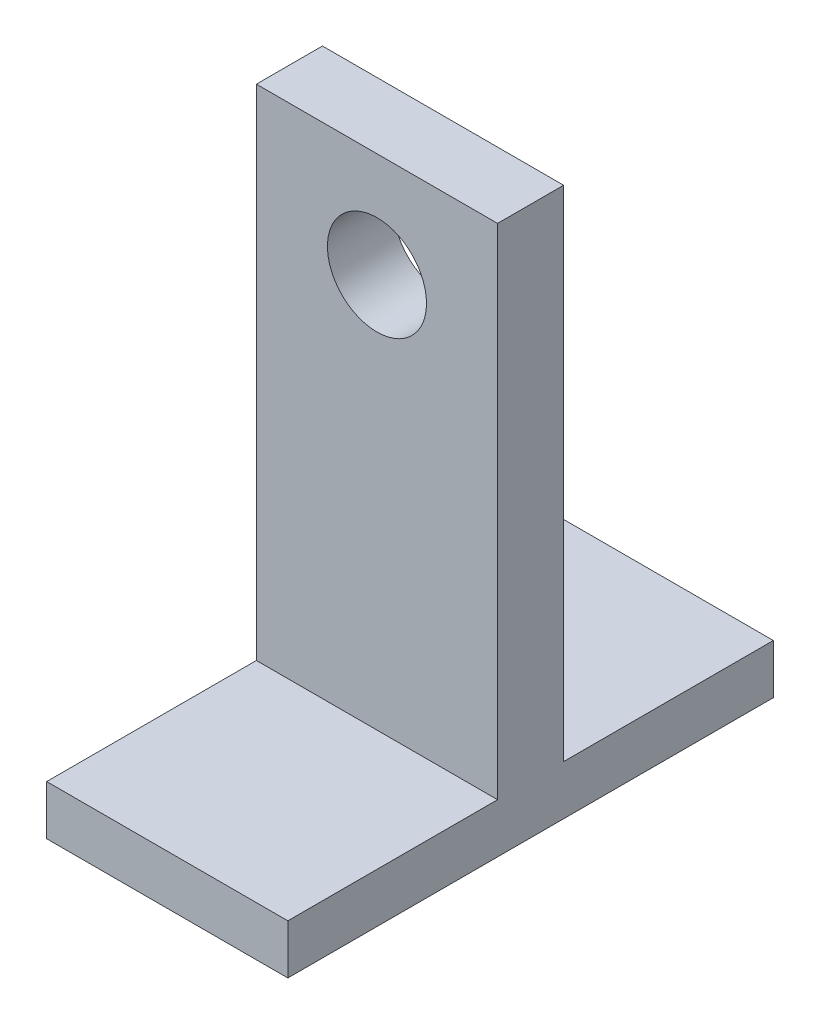
ISO-10303-21;
HEADER;
FILE_DESCRIPTION(('STEP AP214'),'2;1');
FILE_NAME('part.step','',(''),(''),'','','');
FILE_SCHEMA(('AUTOMOTIVE_DESIGN { 1 0 10303 214 1 1 1 1 }'));
ENDSEC;
DATA;
#1=APPLICATION_CONTEXT('core data for automotive mechanical design processes');
#2=APPLICATION_PROTOCOL_DEFINITION('international standard','automotive_design',2000,#1);
#3=PRODUCT_CONTEXT('',#1,'mechanical');
#4=PRODUCT('Part','Part','',(#3));
#5=PRODUCT_RELATED_PRODUCT_CATEGORY('part','',(#4));
#6=PRODUCT_DEFINITION_FORMATION('','',#4);
#7=PRODUCT_DEFINITION_CONTEXT('part definition',#1,'design');
#8=PRODUCT_DEFINITION('design','',#6,#7);
#9=PRODUCT_DEFINITION_SHAPE('','',#8);
#10=(LENGTH_UNIT() NAMED_UNIT(*) SI_UNIT(.MILLI.,.METRE.));
#11=(NAMED_UNIT(*) PLANE_ANGLE_UNIT() SI_UNIT($,.RADIAN.));
#12=(NAMED_UNIT(*) SI_UNIT($,.STERADIAN.) SOLID_ANGLE_UNIT());
#13=UNCERTAINTY_MEASURE_WITH_UNIT(LENGTH_MEASURE(1.E-05),#10,'distance_accuracy_value','');
#14=(GEOMETRIC_REPRESENTATION_CONTEXT(3) GLOBAL_UNCERTAINTY_ASSIGNED_CONTEXT((#13)) GLOBAL_UNIT_ASSIGNED_CONTEXT((#10,
#11,#12)) REPRESENTATION_CONTEXT('',''));
#15=CARTESIAN_POINT('',(0.,0.,0.));
#16=DIRECTION('',(0.,0.,1.));
#17=DIRECTION('',(1.,0.,0.));
#18=AXIS2_PLACEMENT_3D('',#15,#16,#17);
#19=CARTESIAN_POINT('',(3.65125,1.5,7.35));
#20=DIRECTION('',(0.,0.,-1.));
#21=DIRECTION('',(-1.,0.,0.));
#22=AXIS2_PLACEMENT_3D('',#19,#20,#21);
#23=PLANE('',#22);
#24=DIRECTION('',(0.,-1.,0.));
#25=VECTOR('',#24,1.);
#26=CARTESIAN_POINT('',(-3.65125,1.5,7.35));
#27=LINE('',#26,#25);
#28=CARTESIAN_POINT('',(-3.65125,1.5,7.35));
#29=VERTEX_POINT('',#28);
#30=CARTESIAN_POINT('',(-3.65125,0.,7.35));
#31=VERTEX_POINT('',#30);
#32=EDGE_CURVE('E129',#29,#31,#27,.T.);
#33=ORIENTED_EDGE('',*,*,#32,.T.);
#34=DIRECTION('',(-1.,0.,0.));
#35=VECTOR('',#34,1.);
#36=CARTESIAN_POINT('',(3.65125,0.,7.35));
#37=LINE('',#36,#35);
#38=CARTESIAN_POINT('',(3.65125,0.,7.35));
#39=VERTEX_POINT('',#38);
#40=EDGE_CURVE('E11',#39,#31,#37,.T.);
#41=ORIENTED_EDGE('',*,*,#40,.F.);
#42=DIRECTION('',(0.,-1.,0.));
#43=VECTOR('',#42,1.);
#44=CARTESIAN_POINT('',(3.65125,1.5,7.35));
#45=LINE('',#44,#43);
#46=CARTESIAN_POINT('',(3.65125,1.5,7.35));
#47=VERTEX_POINT('',#46);
#48=EDGE_CURVE('E144',#47,#39,#45,.T.);
#49=ORIENTED_EDGE('',*,*,#48,.F.);
#50=DIRECTION('',(-1.,0.,0.));
#51=VECTOR('',#50,1.);
#52=CARTESIAN_POINT('',(3.65125,1.5,7.35));
#53=LINE('',#52,#51);
#54=EDGE_CURVE('E125',#47,#29,#53,.T.);
#55=ORIENTED_EDGE('',*,*,#54,.T.);
#56=EDGE_LOOP('',(#33,#41,#49,#55));
#57=FACE_BOUND('',#56,.T.);
#58=ADVANCED_FACE('F33',(#57),#23,.F.);
#59=CARTESIAN_POINT('',(3.65125,0.,7.35));
#60=DIRECTION('',(0.,1.,0.));
#61=DIRECTION('',(0.,0.,1.));
#62=AXIS2_PLACEMENT_3D('',#59,#60,#61);
#63=PLANE('',#62);
#64=DIRECTION('',(0.,0.,-1.));
#65=VECTOR('',#64,1.);
#66=CARTESIAN_POINT('',(-3.65125,0.,7.35));
#67=LINE('',#66,#65);
#68=CARTESIAN_POINT('',(-3.65125,0.,-7.35));
#69=VERTEX_POINT('',#68);
#70=EDGE_CURVE('E132',#31,#69,#67,.T.);
#71=ORIENTED_EDGE('',*,*,#70,.T.);
#72=DIRECTION('',(-1.,0.,0.));
#73=VECTOR('',#72,1.);
#74=CARTESIAN_POINT('',(3.65125,0.,-7.35));
#75=LINE('',#74,#73);
#76=CARTESIAN_POINT('',(3.65125,0.,-7.35));
#77=VERTEX_POINT('',#76);
#78=EDGE_CURVE('E41',#77,#69,#75,.T.);
#79=ORIENTED_EDGE('',*,*,#78,.F.);
#80=DIRECTION('',(0.,0.,-1.));
#81=VECTOR('',#80,1.);
#82=CARTESIAN_POINT('',(3.65125,0.,7.35));
#83=LINE('',#82,#81);
#84=EDGE_CURVE('E92',#39,#77,#83,.T.);
#85=ORIENTED_EDGE('',*,*,#84,.F.);
#86=ORIENTED_EDGE('',*,*,#40,.T.);
#87=EDGE_LOOP('',(#71,#79,#85,#86));
#88=FACE_BOUND('',#87,.T.);
#89=ADVANCED_FACE('F196',(#88),#63,.F.);
#90=CARTESIAN_POINT('',(3.65125,0.,-7.35));
#91=DIRECTION('',(0.,0.,1.));
#92=DIRECTION('',(1.,0.,0.));
#93=AXIS2_PLACEMENT_3D('',#90,#91,#92);
#94=PLANE('',#93);
#95=DIRECTION('',(0.,1.,0.));
#96=VECTOR('',#95,1.);
#97=CARTESIAN_POINT('',(-3.65125,0.,-7.35));
#98=LINE('',#97,#96);
#99=CARTESIAN_POINT('',(-3.65125,1.5,-7.35));
#100=VERTEX_POINT('',#99);
#101=EDGE_CURVE('E135',#69,#100,#98,.T.);
#102=ORIENTED_EDGE('',*,*,#101,.T.);
#103=DIRECTION('',(-1.,0.,0.));
#104=VECTOR('',#103,1.);
#105=CARTESIAN_POINT('',(3.65125,1.5,-7.35));
#106=LINE('',#105,#104);
#107=CARTESIAN_POINT('',(3.65125,1.5,-7.35));
#108=VERTEX_POINT('',#107);
#109=EDGE_CURVE('E151',#108,#100,#106,.T.);
#110=ORIENTED_EDGE('',*,*,#109,.F.);
#111=DIRECTION('',(0.,1.,0.));
#112=VECTOR('',#111,1.);
#113=CARTESIAN_POINT('',(3.65125,0.,-7.35));
#114=LINE('',#113,#112);
#115=EDGE_CURVE('E159',#77,#108,#114,.T.);
#116=ORIENTED_EDGE('',*,*,#115,.F.);
#117=ORIENTED_EDGE('',*,*,#78,.T.);
#118=EDGE_LOOP('',(#102,#110,#116,#117));
#119=FACE_BOUND('',#118,.T.);
#120=ADVANCED_FACE('F157',(#119),#94,.F.);
#121=CARTESIAN_POINT('',(3.65125,1.5,-7.35));
#122=DIRECTION('',(0.,-1.,0.));
#123=DIRECTION('',(0.,0.,-1.));
#124=AXIS2_PLACEMENT_3D('',#121,#122,#123);
#125=PLANE('',#124);
#126=DIRECTION('',(0.,0.,1.));
#127=VECTOR('',#126,1.);
#128=CARTESIAN_POINT('',(-3.65125,1.5,-7.35));
#129=LINE('',#128,#127);
#130=CARTESIAN_POINT('',(-3.65125,1.5,-0.999999999999998));
#131=VERTEX_POINT('',#130);
#132=EDGE_CURVE('E137',#100,#131,#129,.T.);
#133=ORIENTED_EDGE('',*,*,#132,.T.);
#134=DIRECTION('',(-1.,0.,0.));
#135=VECTOR('',#134,1.);
#136=CARTESIAN_POINT('',(3.65125,1.5,-0.999999999999998));
#137=LINE('',#136,#135);
#138=CARTESIAN_POINT('',(3.65125,1.5,-0.999999999999998));
#139=VERTEX_POINT('',#138);
#140=EDGE_CURVE('E148',#139,#131,#137,.T.);
#141=ORIENTED_EDGE('',*,*,#140,.F.);
#142=DIRECTION('',(0.,0.,1.));
#143=VECTOR('',#142,1.);
#144=CARTESIAN_POINT('',(3.65125,1.5,-7.35));
#145=LINE('',#144,#143);
#146=EDGE_CURVE('E171',#108,#139,#145,.T.);
#147=ORIENTED_EDGE('',*,*,#146,.F.);
#148=ORIENTED_EDGE('',*,*,#109,.T.);
#149=EDGE_LOOP('',(#133,#141,#147,#148));
#150=FACE_BOUND('',#149,.T.);
#151=ADVANCED_FACE('F167',(#150),#125,.F.);
#152=CARTESIAN_POINT('',(3.65125,1.5,-0.999999999999998));
#153=DIRECTION('',(0.,0.,1.));
#154=DIRECTION('',(0.,-1.,0.));
#155=AXIS2_PLACEMENT_3D('',#152,#153,#154);
#156=PLANE('',#155);
#157=CARTESIAN_POINT('',(0.,13.438,-1.));
#158=DIRECTION('',(0.,0.,1.));
#159=DIRECTION('',(0.,-1.,0.));
#160=AXIS2_PLACEMENT_3D('',#157,#158,#159);
#161=CIRCLE('',#160,1.5);
#162=CARTESIAN_POINT('',(0.,11.938,-1.));
#163=VERTEX_POINT('',#162);
#164=EDGE_CURVE('E133',#163,#163,#161,.T.);
#165=ORIENTED_EDGE('',*,*,#164,.T.);
#166=EDGE_LOOP('',(#165));
#167=FACE_BOUND('',#166,.T.);
#168=DIRECTION('',(0.,1.,0.));
#169=VECTOR('',#168,1.);
#170=CARTESIAN_POINT('',(-3.65125,1.5,-0.999999999999998));
#171=LINE('',#170,#169);
#172=CARTESIAN_POINT('',(-3.65125,16.613,-1.));
#173=VERTEX_POINT('',#172);
#174=EDGE_CURVE('E139',#131,#173,#171,.T.);
#175=ORIENTED_EDGE('',*,*,#174,.T.);
#176=DIRECTION('',(-1.,0.,0.));
#177=VECTOR('',#176,1.);
#178=CARTESIAN_POINT('',(3.65125,16.613,-1.));
#179=LINE('',#178,#177);
#180=CARTESIAN_POINT('',(3.65125,16.613,-1.));
#181=VERTEX_POINT('',#180);
#182=EDGE_CURVE('E120',#181,#173,#179,.T.);
#183=ORIENTED_EDGE('',*,*,#182,.F.);
#184=DIRECTION('',(0.,1.,0.));
#185=VECTOR('',#184,1.);
#186=CARTESIAN_POINT('',(3.65125,1.5,-0.999999999999998));
#187=LINE('',#186,#185);
#188=EDGE_CURVE('E111',#139,#181,#187,.T.);
#189=ORIENTED_EDGE('',*,*,#188,.F.);
#190=ORIENTED_EDGE('',*,*,#140,.T.);
#191=EDGE_LOOP('',(#175,#183,#189,#190));
#192=FACE_BOUND('',#191,.T.);
#193=ADVANCED_FACE('F170',(#167,#192),#156,.F.);
#194=CARTESIAN_POINT('',(3.65125,16.613,-1.));
#195=DIRECTION('',(0.,-1.,0.));
#196=DIRECTION('',(0.,0.,-1.));
#197=AXIS2_PLACEMENT_3D('',#194,#195,#196);
#198=PLANE('',#197);
#199=DIRECTION('',(0.,0.,1.));
#200=VECTOR('',#199,1.);
#201=CARTESIAN_POINT('',(-3.65125,16.613,-1.));
#202=LINE('',#201,#200);
#203=CARTESIAN_POINT('',(-3.65125,16.613,1.));
#204=VERTEX_POINT('',#203);
#205=EDGE_CURVE('E119',#173,#204,#202,.T.);
#206=ORIENTED_EDGE('',*,*,#205,.T.);
#207=DIRECTION('',(-1.,0.,0.));
#208=VECTOR('',#207,1.);
#209=CARTESIAN_POINT('',(3.65125,16.613,1.));
#210=LINE('',#209,#208);
#211=CARTESIAN_POINT('',(3.65125,16.613,1.));
#212=VERTEX_POINT('',#211);
#213=EDGE_CURVE('E116',#212,#204,#210,.T.);
#214=ORIENTED_EDGE('',*,*,#213,.F.);
#215=DIRECTION('',(0.,0.,1.));
#216=VECTOR('',#215,1.);
#217=CARTESIAN_POINT('',(3.65125,16.613,-1.));
#218=LINE('',#217,#216);
#219=EDGE_CURVE('E105',#181,#212,#218,.T.);
#220=ORIENTED_EDGE('',*,*,#219,.F.);
#221=ORIENTED_EDGE('',*,*,#182,.T.);
#222=EDGE_LOOP('',(#206,#214,#220,#221));
#223=FACE_BOUND('',#222,.T.);
#224=ADVANCED_FACE('F117',(#223),#198,.F.);
#225=CARTESIAN_POINT('',(3.65125,16.613,1.));
#226=DIRECTION('',(0.,0.,-1.));
#227=DIRECTION('',(0.,1.,0.));
#228=AXIS2_PLACEMENT_3D('',#225,#226,#227);
#229=PLANE('',#228);
#230=CARTESIAN_POINT('',(0.,13.438,0.999999999999998));
#231=DIRECTION('',(0.,0.,1.));
#232=DIRECTION('',(1.,0.,0.));
#233=AXIS2_PLACEMENT_3D('',#230,#231,#232);
#234=CIRCLE('',#233,1.5);
#235=CARTESIAN_POINT('',(1.5,13.438,0.999999999999998));
#236=VERTEX_POINT('',#235);
#237=EDGE_CURVE('E179',#236,#236,#234,.T.);
#238=ORIENTED_EDGE('',*,*,#237,.F.);
#239=EDGE_LOOP('',(#238));
#240=FACE_BOUND('',#239,.T.);
#241=DIRECTION('',(0.,-1.,0.));
#242=VECTOR('',#241,1.);
#243=CARTESIAN_POINT('',(-3.65125,16.613,1.));
#244=LINE('',#243,#242);
#245=CARTESIAN_POINT('',(-3.65125,1.5,0.999999999999998));
#246=VERTEX_POINT('',#245);
#247=EDGE_CURVE('E78',#204,#246,#244,.T.);
#248=ORIENTED_EDGE('',*,*,#247,.T.);
#249=DIRECTION('',(-1.,0.,0.));
#250=VECTOR('',#249,1.);
#251=CARTESIAN_POINT('',(3.65125,1.5,0.999999999999998));
#252=LINE('',#251,#250);
#253=CARTESIAN_POINT('',(3.65125,1.5,0.999999999999998));
#254=VERTEX_POINT('',#253);
#255=EDGE_CURVE('E121',#254,#246,#252,.T.);
#256=ORIENTED_EDGE('',*,*,#255,.F.);
#257=DIRECTION('',(0.,-1.,0.));
#258=VECTOR('',#257,1.);
#259=CARTESIAN_POINT('',(3.65125,16.613,1.));
#260=LINE('',#259,#258);
#261=EDGE_CURVE('E109',#212,#254,#260,.T.);
#262=ORIENTED_EDGE('',*,*,#261,.F.);
#263=ORIENTED_EDGE('',*,*,#213,.T.);
#264=EDGE_LOOP('',(#248,#256,#262,#263));
#265=FACE_BOUND('',#264,.T.);
#266=ADVANCED_FACE('F123',(#240,#265),#229,.F.);
#267=CARTESIAN_POINT('',(3.65125,1.5,0.999999999999998));
#268=DIRECTION('',(0.,-1.,0.));
#269=DIRECTION('',(0.,0.,-1.));
#270=AXIS2_PLACEMENT_3D('',#267,#268,#269);
#271=PLANE('',#270);
#272=DIRECTION('',(0.,0.,1.));
#273=VECTOR('',#272,1.);
#274=CARTESIAN_POINT('',(-3.65125,1.5,0.999999999999998));
#275=LINE('',#274,#273);
#276=EDGE_CURVE('E84',#246,#29,#275,.T.);
#277=ORIENTED_EDGE('',*,*,#276,.T.);
#278=ORIENTED_EDGE('',*,*,#54,.F.);
#279=DIRECTION('',(0.,0.,1.));
#280=VECTOR('',#279,1.);
#281=CARTESIAN_POINT('',(3.65125,1.5,0.999999999999998));
#282=LINE('',#281,#280);
#283=EDGE_CURVE('E49',#254,#47,#282,.T.);
#284=ORIENTED_EDGE('',*,*,#283,.F.);
#285=ORIENTED_EDGE('',*,*,#255,.T.);
#286=EDGE_LOOP('',(#277,#278,#284,#285));
#287=FACE_BOUND('',#286,.T.);
#288=ADVANCED_FACE('F187',(#287),#271,.F.);
#289=CARTESIAN_POINT('',(3.65125,0.,0.));
#290=DIRECTION('',(1.,0.,0.));
#291=DIRECTION('',(0.,0.,-1.));
#292=AXIS2_PLACEMENT_3D('',#289,#290,#291);
#293=PLANE('',#292);
#294=ORIENTED_EDGE('',*,*,#48,.T.);
#295=ORIENTED_EDGE('',*,*,#84,.T.);
#296=ORIENTED_EDGE('',*,*,#115,.T.);
#297=ORIENTED_EDGE('',*,*,#146,.T.);
#298=ORIENTED_EDGE('',*,*,#188,.T.);
#299=ORIENTED_EDGE('',*,*,#219,.T.);
#300=ORIENTED_EDGE('',*,*,#261,.T.);
#301=ORIENTED_EDGE('',*,*,#283,.T.);
#302=EDGE_LOOP('',(#294,#295,#296,#297,#298,#299,#300,#301));
#303=FACE_BOUND('',#302,.T.);
#304=ADVANCED_FACE('F107',(#303),#293,.T.);
#305=CARTESIAN_POINT('',(-3.65125,0.,0.));
#306=DIRECTION('',(1.,0.,0.));
#307=DIRECTION('',(0.,0.,-1.));
#308=AXIS2_PLACEMENT_3D('',#305,#306,#307);
#309=PLANE('',#308);
#310=ORIENTED_EDGE('',*,*,#32,.F.);
#311=ORIENTED_EDGE('',*,*,#276,.F.);
#312=ORIENTED_EDGE('',*,*,#247,.F.);
#313=ORIENTED_EDGE('',*,*,#205,.F.);
#314=ORIENTED_EDGE('',*,*,#174,.F.);
#315=ORIENTED_EDGE('',*,*,#132,.F.);
#316=ORIENTED_EDGE('',*,*,#101,.F.);
#317=ORIENTED_EDGE('',*,*,#70,.F.);
#318=EDGE_LOOP('',(#310,#311,#312,#313,#314,#315,#316,#317));
#319=FACE_BOUND('',#318,.T.);
#320=ADVANCED_FACE('F163',(#319),#309,.F.);
#321=CARTESIAN_POINT('',(0.,13.438,-7.35));
#322=DIRECTION('',(0.,0.,1.));
#323=DIRECTION('',(1.,0.,0.));
#324=AXIS2_PLACEMENT_3D('',#321,#322,#323);
#325=CYLINDRICAL_SURFACE('',#324,1.5);
#326=ORIENTED_EDGE('',*,*,#237,.T.);
#327=EDGE_LOOP('',(#326));
#328=FACE_BOUND('',#327,.T.);
#329=ORIENTED_EDGE('',*,*,#164,.F.);
#330=EDGE_LOOP('',(#329));
#331=FACE_BOUND('',#330,.T.);
#332=ADVANCED_FACE('F183',(#328,#331),#325,.F.);
#333=CLOSED_SHELL('',(#58,#89,#120,#151,#193,#224,#266,#288,#304,#320,#332));
#334=MANIFOLD_SOLID_BREP('B2',#333);
#335=ADVANCED_BREP_SHAPE_REPRESENTATION('',(#18,#334),#14);
#336=SHAPE_DEFINITION_REPRESENTATION(#9,#335);
ENDSEC;
END-ISO-10303-21;
